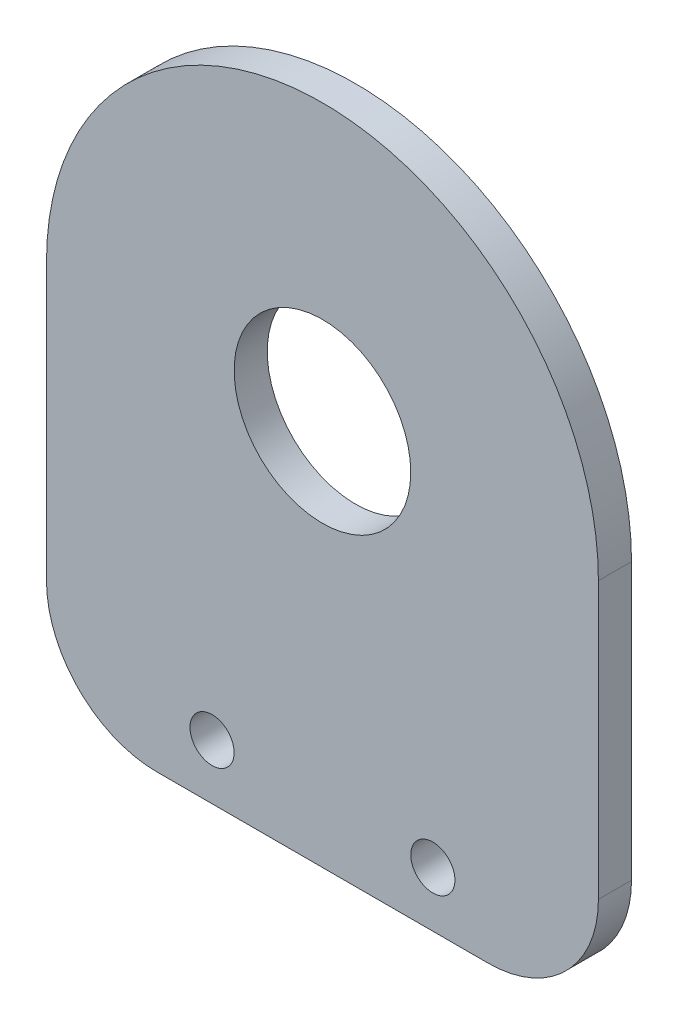
ISO-10303-21;
HEADER;
FILE_DESCRIPTION(('STEP AP214'),'2;1');
FILE_NAME('part.step','',(''),(''),'','','');
FILE_SCHEMA(('AUTOMOTIVE_DESIGN { 1 0 10303 214 1 1 1 1 }'));
ENDSEC;
DATA;
#1=APPLICATION_CONTEXT('core data for automotive mechanical design processes');
#2=APPLICATION_PROTOCOL_DEFINITION('international standard','automotive_design',2000,#1);
#3=PRODUCT_CONTEXT('',#1,'mechanical');
#4=PRODUCT('Part','Part','',(#3));
#5=PRODUCT_RELATED_PRODUCT_CATEGORY('part','',(#4));
#6=PRODUCT_DEFINITION_FORMATION('','',#4);
#7=PRODUCT_DEFINITION_CONTEXT('part definition',#1,'design');
#8=PRODUCT_DEFINITION('design','',#6,#7);
#9=PRODUCT_DEFINITION_SHAPE('','',#8);
#10=(LENGTH_UNIT() NAMED_UNIT(*) SI_UNIT(.MILLI.,.METRE.));
#11=(NAMED_UNIT(*) PLANE_ANGLE_UNIT() SI_UNIT($,.RADIAN.));
#12=(NAMED_UNIT(*) SI_UNIT($,.STERADIAN.) SOLID_ANGLE_UNIT());
#13=UNCERTAINTY_MEASURE_WITH_UNIT(LENGTH_MEASURE(1.E-05),#10,'distance_accuracy_value','');
#14=(GEOMETRIC_REPRESENTATION_CONTEXT(3) GLOBAL_UNCERTAINTY_ASSIGNED_CONTEXT((#13)) GLOBAL_UNIT_ASSIGNED_CONTEXT((#10,
#11,#12)) REPRESENTATION_CONTEXT('',''));
#15=CARTESIAN_POINT('',(0.,0.,0.));
#16=DIRECTION('',(0.,0.,1.));
#17=DIRECTION('',(1.,0.,0.));
#18=AXIS2_PLACEMENT_3D('',#15,#16,#17);
#19=CARTESIAN_POINT('',(0.,17.5,3.));
#20=DIRECTION('',(0.,0.,1.));
#21=DIRECTION('',(1.,0.,0.));
#22=AXIS2_PLACEMENT_3D('',#19,#20,#21);
#23=PLANE('',#22);
#24=CARTESIAN_POINT('',(-10.,-12.5,3.));
#25=DIRECTION('',(0.,0.,1.));
#26=DIRECTION('',(1.,0.,0.));
#27=AXIS2_PLACEMENT_3D('',#24,#25,#26);
#28=CIRCLE('',#27,2.);
#29=CARTESIAN_POINT('',(-8.,-12.5,3.));
#30=VERTEX_POINT('',#29);
#31=EDGE_CURVE('E150',#30,#30,#28,.T.);
#32=ORIENTED_EDGE('',*,*,#31,.F.);
#33=EDGE_LOOP('',(#32));
#34=FACE_BOUND('',#33,.T.);
#35=DIRECTION('',(1.,0.,0.));
#36=VECTOR('',#35,1.);
#37=CARTESIAN_POINT('',(25.,-17.5,3.));
#38=LINE('',#37,#36);
#39=CARTESIAN_POINT('',(-15.,-17.5,3.));
#40=VERTEX_POINT('',#39);
#41=CARTESIAN_POINT('',(15.,-17.5,3.));
#42=VERTEX_POINT('',#41);
#43=EDGE_CURVE('E93',#40,#42,#38,.T.);
#44=ORIENTED_EDGE('',*,*,#43,.T.);
#45=CARTESIAN_POINT('',(15.,-7.5,3.));
#46=DIRECTION('',(0.,0.,1.));
#47=DIRECTION('',(1.,0.,0.));
#48=AXIS2_PLACEMENT_3D('',#45,#46,#47);
#49=CIRCLE('',#48,10.);
#50=CARTESIAN_POINT('',(25.,-7.5,3.));
#51=VERTEX_POINT('',#50);
#52=EDGE_CURVE('E41',#42,#51,#49,.T.);
#53=ORIENTED_EDGE('',*,*,#52,.T.);
#54=DIRECTION('',(0.,1.,0.));
#55=VECTOR('',#54,1.);
#56=CARTESIAN_POINT('',(25.,-17.5,3.));
#57=LINE('',#56,#55);
#58=CARTESIAN_POINT('',(25.,17.5,3.));
#59=VERTEX_POINT('',#58);
#60=EDGE_CURVE('E99',#51,#59,#57,.T.);
#61=ORIENTED_EDGE('',*,*,#60,.T.);
#62=CARTESIAN_POINT('',(0.,17.5,3.));
#63=DIRECTION('',(0.,0.,1.));
#64=DIRECTION('',(1.,0.,0.));
#65=AXIS2_PLACEMENT_3D('',#62,#63,#64);
#66=CIRCLE('',#65,25.);
#67=CARTESIAN_POINT('',(-25.,17.5,3.));
#68=VERTEX_POINT('',#67);
#69=EDGE_CURVE('E94',#59,#68,#66,.T.);
#70=ORIENTED_EDGE('',*,*,#69,.T.);
#71=DIRECTION('',(0.,-1.,0.));
#72=VECTOR('',#71,1.);
#73=CARTESIAN_POINT('',(-25.,-17.5,3.));
#74=LINE('',#73,#72);
#75=CARTESIAN_POINT('',(-25.,-7.50000000000001,3.));
#76=VERTEX_POINT('',#75);
#77=EDGE_CURVE('E85',#68,#76,#74,.T.);
#78=ORIENTED_EDGE('',*,*,#77,.T.);
#79=CARTESIAN_POINT('',(-15.,-7.50000000000001,3.));
#80=DIRECTION('',(0.,0.,1.));
#81=DIRECTION('',(1.,0.,0.));
#82=AXIS2_PLACEMENT_3D('',#79,#80,#81);
#83=CIRCLE('',#82,10.);
#84=EDGE_CURVE('E124',#76,#40,#83,.T.);
#85=ORIENTED_EDGE('',*,*,#84,.T.);
#86=EDGE_LOOP('',(#44,#53,#61,#70,#78,#85));
#87=FACE_BOUND('',#86,.T.);
#88=CARTESIAN_POINT('',(0.,17.5,3.));
#89=DIRECTION('',(0.,0.,1.));
#90=DIRECTION('',(1.,0.,0.));
#91=AXIS2_PLACEMENT_3D('',#88,#89,#90);
#92=CIRCLE('',#91,8.);
#93=CARTESIAN_POINT('',(8.,17.5,3.));
#94=VERTEX_POINT('',#93);
#95=EDGE_CURVE('E144',#94,#94,#92,.T.);
#96=ORIENTED_EDGE('',*,*,#95,.F.);
#97=EDGE_LOOP('',(#96));
#98=FACE_BOUND('',#97,.T.);
#99=CARTESIAN_POINT('',(10.,-12.5,3.));
#100=DIRECTION('',(0.,0.,1.));
#101=DIRECTION('',(1.,0.,0.));
#102=AXIS2_PLACEMENT_3D('',#99,#100,#101);
#103=CIRCLE('',#102,2.);
#104=CARTESIAN_POINT('',(12.,-12.5,3.));
#105=VERTEX_POINT('',#104);
#106=EDGE_CURVE('E156',#105,#105,#103,.T.);
#107=ORIENTED_EDGE('',*,*,#106,.F.);
#108=EDGE_LOOP('',(#107));
#109=FACE_BOUND('',#108,.T.);
#110=ADVANCED_FACE('F33',(#34,#87,#98,#109),#23,.T.);
#111=CARTESIAN_POINT('',(0.,17.5,0.));
#112=DIRECTION('',(0.,0.,1.));
#113=DIRECTION('',(1.,0.,0.));
#114=AXIS2_PLACEMENT_3D('',#111,#112,#113);
#115=PLANE('',#114);
#116=DIRECTION('',(0.,1.,0.));
#117=VECTOR('',#116,1.);
#118=CARTESIAN_POINT('',(25.,-17.5,0.));
#119=LINE('',#118,#117);
#120=CARTESIAN_POINT('',(25.,-7.5,0.));
#121=VERTEX_POINT('',#120);
#122=CARTESIAN_POINT('',(25.,17.5,0.));
#123=VERTEX_POINT('',#122);
#124=EDGE_CURVE('E103',#121,#123,#119,.T.);
#125=ORIENTED_EDGE('',*,*,#124,.F.);
#126=CARTESIAN_POINT('',(15.,-7.5,0.));
#127=DIRECTION('',(0.,0.,1.));
#128=DIRECTION('',(1.,0.,0.));
#129=AXIS2_PLACEMENT_3D('',#126,#127,#128);
#130=CIRCLE('',#129,10.);
#131=CARTESIAN_POINT('',(15.,-17.5,0.));
#132=VERTEX_POINT('',#131);
#133=EDGE_CURVE('E118',#121,#132,#130,.F.);
#134=ORIENTED_EDGE('',*,*,#133,.T.);
#135=DIRECTION('',(1.,0.,0.));
#136=VECTOR('',#135,1.);
#137=CARTESIAN_POINT('',(25.,-17.5,0.));
#138=LINE('',#137,#136);
#139=CARTESIAN_POINT('',(-15.,-17.5,0.));
#140=VERTEX_POINT('',#139);
#141=EDGE_CURVE('E137',#140,#132,#138,.T.);
#142=ORIENTED_EDGE('',*,*,#141,.F.);
#143=CARTESIAN_POINT('',(-15.,-7.50000000000001,0.));
#144=DIRECTION('',(0.,0.,1.));
#145=DIRECTION('',(1.,0.,0.));
#146=AXIS2_PLACEMENT_3D('',#143,#144,#145);
#147=CIRCLE('',#146,10.);
#148=CARTESIAN_POINT('',(-25.,-7.50000000000001,0.));
#149=VERTEX_POINT('',#148);
#150=EDGE_CURVE('E112',#140,#149,#147,.F.);
#151=ORIENTED_EDGE('',*,*,#150,.T.);
#152=DIRECTION('',(0.,-1.,0.));
#153=VECTOR('',#152,1.);
#154=CARTESIAN_POINT('',(-25.,-17.5,0.));
#155=LINE('',#154,#153);
#156=CARTESIAN_POINT('',(-25.,17.5,0.));
#157=VERTEX_POINT('',#156);
#158=EDGE_CURVE('E140',#157,#149,#155,.T.);
#159=ORIENTED_EDGE('',*,*,#158,.F.);
#160=CARTESIAN_POINT('',(0.,17.5,0.));
#161=DIRECTION('',(0.,0.,1.));
#162=DIRECTION('',(1.,0.,0.));
#163=AXIS2_PLACEMENT_3D('',#160,#161,#162);
#164=CIRCLE('',#163,25.);
#165=EDGE_CURVE('E107',#123,#157,#164,.T.);
#166=ORIENTED_EDGE('',*,*,#165,.F.);
#167=EDGE_LOOP('',(#125,#134,#142,#151,#159,#166));
#168=FACE_BOUND('',#167,.T.);
#169=CARTESIAN_POINT('',(0.,17.5,0.));
#170=DIRECTION('',(0.,0.,1.));
#171=DIRECTION('',(1.,0.,0.));
#172=AXIS2_PLACEMENT_3D('',#169,#170,#171);
#173=CIRCLE('',#172,8.);
#174=CARTESIAN_POINT('',(8.,17.5,0.));
#175=VERTEX_POINT('',#174);
#176=EDGE_CURVE('E147',#175,#175,#173,.T.);
#177=ORIENTED_EDGE('',*,*,#176,.T.);
#178=EDGE_LOOP('',(#177));
#179=FACE_BOUND('',#178,.T.);
#180=CARTESIAN_POINT('',(-10.,-12.5,0.));
#181=DIRECTION('',(0.,0.,1.));
#182=DIRECTION('',(1.,0.,0.));
#183=AXIS2_PLACEMENT_3D('',#180,#181,#182);
#184=CIRCLE('',#183,2.);
#185=CARTESIAN_POINT('',(-8.,-12.5,0.));
#186=VERTEX_POINT('',#185);
#187=EDGE_CURVE('E153',#186,#186,#184,.T.);
#188=ORIENTED_EDGE('',*,*,#187,.T.);
#189=EDGE_LOOP('',(#188));
#190=FACE_BOUND('',#189,.T.);
#191=CARTESIAN_POINT('',(10.,-12.5,0.));
#192=DIRECTION('',(0.,0.,1.));
#193=DIRECTION('',(1.,0.,0.));
#194=AXIS2_PLACEMENT_3D('',#191,#192,#193);
#195=CIRCLE('',#194,2.);
#196=CARTESIAN_POINT('',(12.,-12.5,0.));
#197=VERTEX_POINT('',#196);
#198=EDGE_CURVE('E159',#197,#197,#195,.T.);
#199=ORIENTED_EDGE('',*,*,#198,.T.);
#200=EDGE_LOOP('',(#199));
#201=FACE_BOUND('',#200,.T.);
#202=ADVANCED_FACE('F135',(#168,#179,#190,#201),#115,.F.);
#203=CARTESIAN_POINT('',(0.,17.5,3.));
#204=DIRECTION('',(0.,0.,-1.));
#205=DIRECTION('',(-1.,0.,0.));
#206=AXIS2_PLACEMENT_3D('',#203,#204,#205);
#207=CYLINDRICAL_SURFACE('',#206,25.);
#208=ORIENTED_EDGE('',*,*,#165,.T.);
#209=DIRECTION('',(0.,0.,-1.));
#210=VECTOR('',#209,1.);
#211=CARTESIAN_POINT('',(-25.,17.5,3.));
#212=LINE('',#211,#210);
#213=EDGE_CURVE('E89',#68,#157,#212,.T.);
#214=ORIENTED_EDGE('',*,*,#213,.F.);
#215=ORIENTED_EDGE('',*,*,#69,.F.);
#216=DIRECTION('',(0.,0.,-1.));
#217=VECTOR('',#216,1.);
#218=CARTESIAN_POINT('',(25.,17.5,3.));
#219=LINE('',#218,#217);
#220=EDGE_CURVE('E109',#59,#123,#219,.T.);
#221=ORIENTED_EDGE('',*,*,#220,.T.);
#222=EDGE_LOOP('',(#208,#214,#215,#221));
#223=FACE_BOUND('',#222,.T.);
#224=ADVANCED_FACE('F105',(#223),#207,.T.);
#225=CARTESIAN_POINT('',(-25.,-17.5,3.));
#226=DIRECTION('',(1.,0.,0.));
#227=DIRECTION('',(0.,0.,-1.));
#228=AXIS2_PLACEMENT_3D('',#225,#226,#227);
#229=PLANE('',#228);
#230=ORIENTED_EDGE('',*,*,#158,.T.);
#231=DIRECTION('',(0.,0.,-1.));
#232=VECTOR('',#231,1.);
#233=CARTESIAN_POINT('',(-25.,-7.50000000000001,3.));
#234=LINE('',#233,#232);
#235=EDGE_CURVE('E11',#149,#76,#234,.F.);
#236=ORIENTED_EDGE('',*,*,#235,.T.);
#237=ORIENTED_EDGE('',*,*,#77,.F.);
#238=ORIENTED_EDGE('',*,*,#213,.T.);
#239=EDGE_LOOP('',(#230,#236,#237,#238));
#240=FACE_BOUND('',#239,.T.);
#241=ADVANCED_FACE('F87',(#240),#229,.F.);
#242=CARTESIAN_POINT('',(25.,-17.5,3.));
#243=DIRECTION('',(0.,1.,0.));
#244=DIRECTION('',(-1.,0.,0.));
#245=AXIS2_PLACEMENT_3D('',#242,#243,#244);
#246=PLANE('',#245);
#247=ORIENTED_EDGE('',*,*,#141,.T.);
#248=DIRECTION('',(0.,0.,-1.));
#249=VECTOR('',#248,1.);
#250=CARTESIAN_POINT('',(15.,-17.5,3.));
#251=LINE('',#250,#249);
#252=EDGE_CURVE('E54',#132,#42,#251,.F.);
#253=ORIENTED_EDGE('',*,*,#252,.T.);
#254=ORIENTED_EDGE('',*,*,#43,.F.);
#255=DIRECTION('',(0.,0.,-1.));
#256=VECTOR('',#255,1.);
#257=CARTESIAN_POINT('',(-15.,-17.5,3.));
#258=LINE('',#257,#256);
#259=EDGE_CURVE('E120',#40,#140,#258,.T.);
#260=ORIENTED_EDGE('',*,*,#259,.T.);
#261=EDGE_LOOP('',(#247,#253,#254,#260));
#262=FACE_BOUND('',#261,.T.);
#263=ADVANCED_FACE('F138',(#262),#246,.F.);
#264=CARTESIAN_POINT('',(25.,-17.5,3.));
#265=DIRECTION('',(-1.,0.,0.));
#266=DIRECTION('',(0.,0.,1.));
#267=AXIS2_PLACEMENT_3D('',#264,#265,#266);
#268=PLANE('',#267);
#269=ORIENTED_EDGE('',*,*,#60,.F.);
#270=DIRECTION('',(0.,0.,-1.));
#271=VECTOR('',#270,1.);
#272=CARTESIAN_POINT('',(25.,-7.5,3.));
#273=LINE('',#272,#271);
#274=EDGE_CURVE('E108',#51,#121,#273,.T.);
#275=ORIENTED_EDGE('',*,*,#274,.T.);
#276=ORIENTED_EDGE('',*,*,#124,.T.);
#277=ORIENTED_EDGE('',*,*,#220,.F.);
#278=EDGE_LOOP('',(#269,#275,#276,#277));
#279=FACE_BOUND('',#278,.T.);
#280=ADVANCED_FACE('F129',(#279),#268,.F.);
#281=CARTESIAN_POINT('',(0.,17.5,3.));
#282=DIRECTION('',(0.,0.,-1.));
#283=DIRECTION('',(-1.,0.,0.));
#284=AXIS2_PLACEMENT_3D('',#281,#282,#283);
#285=CYLINDRICAL_SURFACE('',#284,8.);
#286=ORIENTED_EDGE('',*,*,#95,.T.);
#287=EDGE_LOOP('',(#286));
#288=FACE_BOUND('',#287,.T.);
#289=ORIENTED_EDGE('',*,*,#176,.F.);
#290=EDGE_LOOP('',(#289));
#291=FACE_BOUND('',#290,.T.);
#292=ADVANCED_FACE('F177',(#288,#291),#285,.F.);
#293=CARTESIAN_POINT('',(-10.,-12.5,3.));
#294=DIRECTION('',(0.,0.,-1.));
#295=DIRECTION('',(-1.,0.,0.));
#296=AXIS2_PLACEMENT_3D('',#293,#294,#295);
#297=CYLINDRICAL_SURFACE('',#296,2.);
#298=ORIENTED_EDGE('',*,*,#31,.T.);
#299=EDGE_LOOP('',(#298));
#300=FACE_BOUND('',#299,.T.);
#301=ORIENTED_EDGE('',*,*,#187,.F.);
#302=EDGE_LOOP('',(#301));
#303=FACE_BOUND('',#302,.T.);
#304=ADVANCED_FACE('F193',(#300,#303),#297,.F.);
#305=CARTESIAN_POINT('',(10.,-12.5,3.));
#306=DIRECTION('',(0.,0.,-1.));
#307=DIRECTION('',(-1.,0.,0.));
#308=AXIS2_PLACEMENT_3D('',#305,#306,#307);
#309=CYLINDRICAL_SURFACE('',#308,2.);
#310=ORIENTED_EDGE('',*,*,#106,.T.);
#311=EDGE_LOOP('',(#310));
#312=FACE_BOUND('',#311,.T.);
#313=ORIENTED_EDGE('',*,*,#198,.F.);
#314=EDGE_LOOP('',(#313));
#315=FACE_BOUND('',#314,.T.);
#316=ADVANCED_FACE('F165',(#312,#315),#309,.F.);
#317=CARTESIAN_POINT('',(15.,-7.5,3.));
#318=DIRECTION('',(0.,0.,-1.));
#319=DIRECTION('',(-1.,0.,0.));
#320=AXIS2_PLACEMENT_3D('',#317,#318,#319);
#321=CYLINDRICAL_SURFACE('',#320,10.);
#322=ORIENTED_EDGE('',*,*,#52,.F.);
#323=ORIENTED_EDGE('',*,*,#252,.F.);
#324=ORIENTED_EDGE('',*,*,#133,.F.);
#325=ORIENTED_EDGE('',*,*,#274,.F.);
#326=EDGE_LOOP('',(#322,#323,#324,#325));
#327=FACE_BOUND('',#326,.T.);
#328=ADVANCED_FACE('F132',(#327),#321,.T.);
#329=CARTESIAN_POINT('',(-15.,-7.50000000000001,3.));
#330=DIRECTION('',(0.,0.,-1.));
#331=DIRECTION('',(-1.,0.,0.));
#332=AXIS2_PLACEMENT_3D('',#329,#330,#331);
#333=CYLINDRICAL_SURFACE('',#332,10.);
#334=ORIENTED_EDGE('',*,*,#84,.F.);
#335=ORIENTED_EDGE('',*,*,#235,.F.);
#336=ORIENTED_EDGE('',*,*,#150,.F.);
#337=ORIENTED_EDGE('',*,*,#259,.F.);
#338=EDGE_LOOP('',(#334,#335,#336,#337));
#339=FACE_BOUND('',#338,.T.);
#340=ADVANCED_FACE('F35',(#339),#333,.T.);
#341=CLOSED_SHELL('',(#110,#202,#224,#241,#263,#280,#292,#304,#316,#328,#340));
#342=MANIFOLD_SOLID_BREP('B2',#341);
#343=ADVANCED_BREP_SHAPE_REPRESENTATION('',(#18,#342),#14);
#344=SHAPE_DEFINITION_REPRESENTATION(#9,#343);
ENDSEC;
END-ISO-10303-21;
